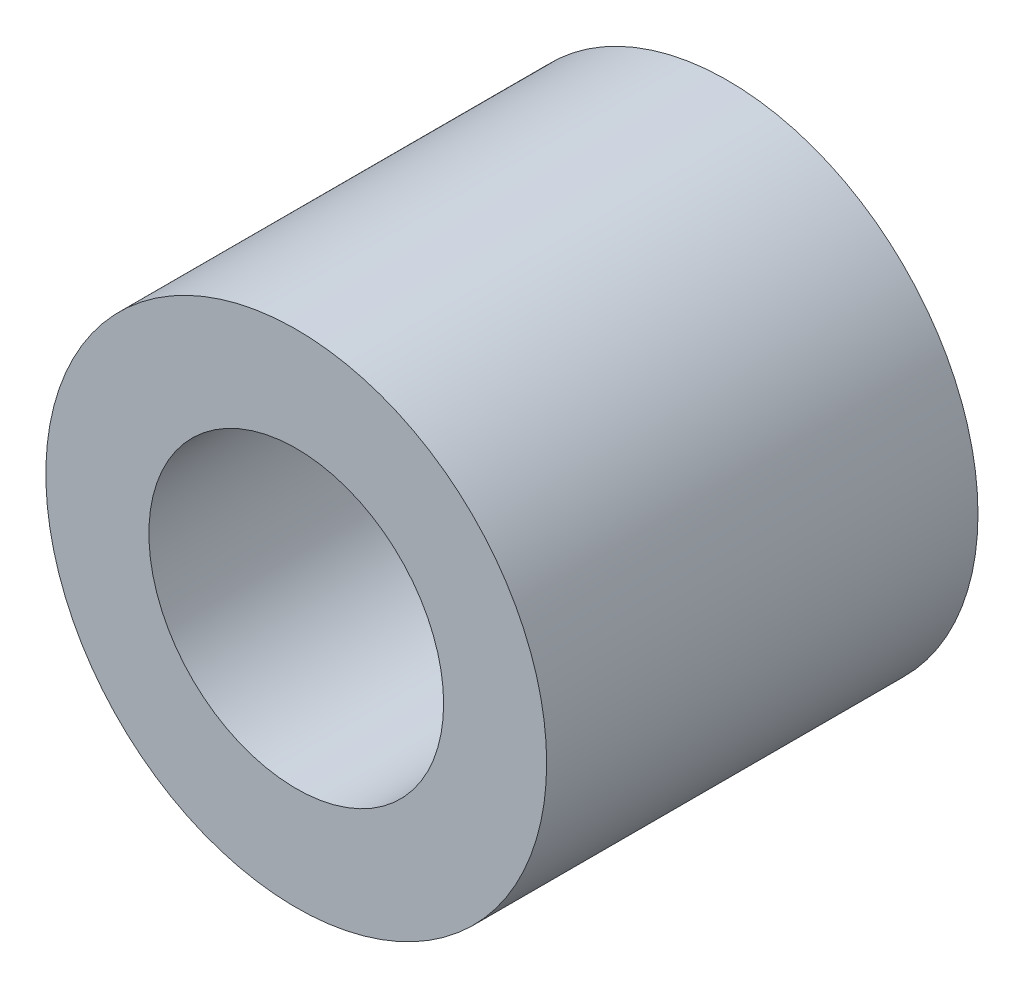
ISO-10303-21;
HEADER;
FILE_DESCRIPTION(('STEP AP214'),'2;1');
FILE_NAME('part.step','',(''),(''),'','','');
FILE_SCHEMA(('AUTOMOTIVE_DESIGN { 1 0 10303 214 1 1 1 1 }'));
ENDSEC;
DATA;
#1=APPLICATION_CONTEXT('core data for automotive mechanical design processes');
#2=APPLICATION_PROTOCOL_DEFINITION('international standard','automotive_design',2000,#1);
#3=PRODUCT_CONTEXT('',#1,'mechanical');
#4=PRODUCT('Part','Part','',(#3));
#5=PRODUCT_RELATED_PRODUCT_CATEGORY('part','',(#4));
#6=PRODUCT_DEFINITION_FORMATION('','',#4);
#7=PRODUCT_DEFINITION_CONTEXT('part definition',#1,'design');
#8=PRODUCT_DEFINITION('design','',#6,#7);
#9=PRODUCT_DEFINITION_SHAPE('','',#8);
#10=(LENGTH_UNIT() NAMED_UNIT(*) SI_UNIT(.MILLI.,.METRE.));
#11=(NAMED_UNIT(*) PLANE_ANGLE_UNIT() SI_UNIT($,.RADIAN.));
#12=(NAMED_UNIT(*) SI_UNIT($,.STERADIAN.) SOLID_ANGLE_UNIT());
#13=UNCERTAINTY_MEASURE_WITH_UNIT(LENGTH_MEASURE(1.E-05),#10,'distance_accuracy_value','');
#14=(GEOMETRIC_REPRESENTATION_CONTEXT(3) GLOBAL_UNCERTAINTY_ASSIGNED_CONTEXT((#13)) GLOBAL_UNIT_ASSIGNED_CONTEXT((#10,
#11,#12)) REPRESENTATION_CONTEXT('',''));
#15=CARTESIAN_POINT('',(0.,0.,0.));
#16=DIRECTION('',(0.,0.,1.));
#17=DIRECTION('',(1.,0.,0.));
#18=AXIS2_PLACEMENT_3D('',#15,#16,#17);
#19=CARTESIAN_POINT('',(0.,0.,18.));
#20=DIRECTION('',(0.,0.,1.));
#21=DIRECTION('',(1.,0.,0.));
#22=AXIS2_PLACEMENT_3D('',#19,#20,#21);
#23=PLANE('',#22);
#24=CARTESIAN_POINT('',(0.,0.,18.));
#25=DIRECTION('',(0.,0.,1.));
#26=DIRECTION('',(1.,0.,0.));
#27=AXIS2_PLACEMENT_3D('',#24,#25,#26);
#28=CIRCLE('',#27,10.45);
#29=CARTESIAN_POINT('',(10.45,0.,18.));
#30=VERTEX_POINT('',#29);
#31=EDGE_CURVE('E10',#30,#30,#28,.T.);
#32=ORIENTED_EDGE('',*,*,#31,.T.);
#33=EDGE_LOOP('',(#32));
#34=FACE_BOUND('',#33,.T.);
#35=CARTESIAN_POINT('',(0.,0.,18.));
#36=DIRECTION('',(0.,0.,1.));
#37=DIRECTION('',(1.,0.,0.));
#38=AXIS2_PLACEMENT_3D('',#35,#36,#37);
#39=CIRCLE('',#38,6.15);
#40=CARTESIAN_POINT('',(6.15,0.,18.));
#41=VERTEX_POINT('',#40);
#42=EDGE_CURVE('E42',#41,#41,#39,.T.);
#43=ORIENTED_EDGE('',*,*,#42,.F.);
#44=EDGE_LOOP('',(#43));
#45=FACE_BOUND('',#44,.T.);
#46=ADVANCED_FACE('F31',(#34,#45),#23,.T.);
#47=CARTESIAN_POINT('',(0.,0.,0.));
#48=DIRECTION('',(0.,0.,1.));
#49=DIRECTION('',(1.,0.,0.));
#50=AXIS2_PLACEMENT_3D('',#47,#48,#49);
#51=PLANE('',#50);
#52=CARTESIAN_POINT('',(0.,0.,0.));
#53=DIRECTION('',(0.,0.,1.));
#54=DIRECTION('',(1.,0.,0.));
#55=AXIS2_PLACEMENT_3D('',#52,#53,#54);
#56=CIRCLE('',#55,10.45);
#57=CARTESIAN_POINT('',(10.45,0.,0.));
#58=VERTEX_POINT('',#57);
#59=EDGE_CURVE('E35',#58,#58,#56,.T.);
#60=ORIENTED_EDGE('',*,*,#59,.F.);
#61=EDGE_LOOP('',(#60));
#62=FACE_BOUND('',#61,.T.);
#63=CARTESIAN_POINT('',(0.,0.,0.));
#64=DIRECTION('',(0.,0.,1.));
#65=DIRECTION('',(1.,0.,0.));
#66=AXIS2_PLACEMENT_3D('',#63,#64,#65);
#67=CIRCLE('',#66,6.15);
#68=CARTESIAN_POINT('',(6.15,0.,0.));
#69=VERTEX_POINT('',#68);
#70=EDGE_CURVE('E44',#69,#69,#67,.T.);
#71=ORIENTED_EDGE('',*,*,#70,.T.);
#72=EDGE_LOOP('',(#71));
#73=FACE_BOUND('',#72,.T.);
#74=ADVANCED_FACE('F54',(#62,#73),#51,.F.);
#75=CARTESIAN_POINT('',(0.,0.,18.));
#76=DIRECTION('',(0.,0.,-1.));
#77=DIRECTION('',(-1.,0.,0.));
#78=AXIS2_PLACEMENT_3D('',#75,#76,#77);
#79=CYLINDRICAL_SURFACE('',#78,10.45);
#80=ORIENTED_EDGE('',*,*,#31,.F.);
#81=EDGE_LOOP('',(#80));
#82=FACE_BOUND('',#81,.T.);
#83=ORIENTED_EDGE('',*,*,#59,.T.);
#84=EDGE_LOOP('',(#83));
#85=FACE_BOUND('',#84,.T.);
#86=ADVANCED_FACE('F33',(#82,#85),#79,.T.);
#87=CARTESIAN_POINT('',(0.,0.,18.));
#88=DIRECTION('',(0.,0.,-1.));
#89=DIRECTION('',(-1.,0.,0.));
#90=AXIS2_PLACEMENT_3D('',#87,#88,#89);
#91=CYLINDRICAL_SURFACE('',#90,6.15);
#92=ORIENTED_EDGE('',*,*,#42,.T.);
#93=EDGE_LOOP('',(#92));
#94=FACE_BOUND('',#93,.T.);
#95=ORIENTED_EDGE('',*,*,#70,.F.);
#96=EDGE_LOOP('',(#95));
#97=FACE_BOUND('',#96,.T.);
#98=ADVANCED_FACE('F50',(#94,#97),#91,.F.);
#99=CLOSED_SHELL('',(#46,#74,#86,#98));
#100=MANIFOLD_SOLID_BREP('B2',#99);
#101=ADVANCED_BREP_SHAPE_REPRESENTATION('',(#18,#100),#14);
#102=SHAPE_DEFINITION_REPRESENTATION(#9,#101);
ENDSEC;
END-ISO-10303-21;
